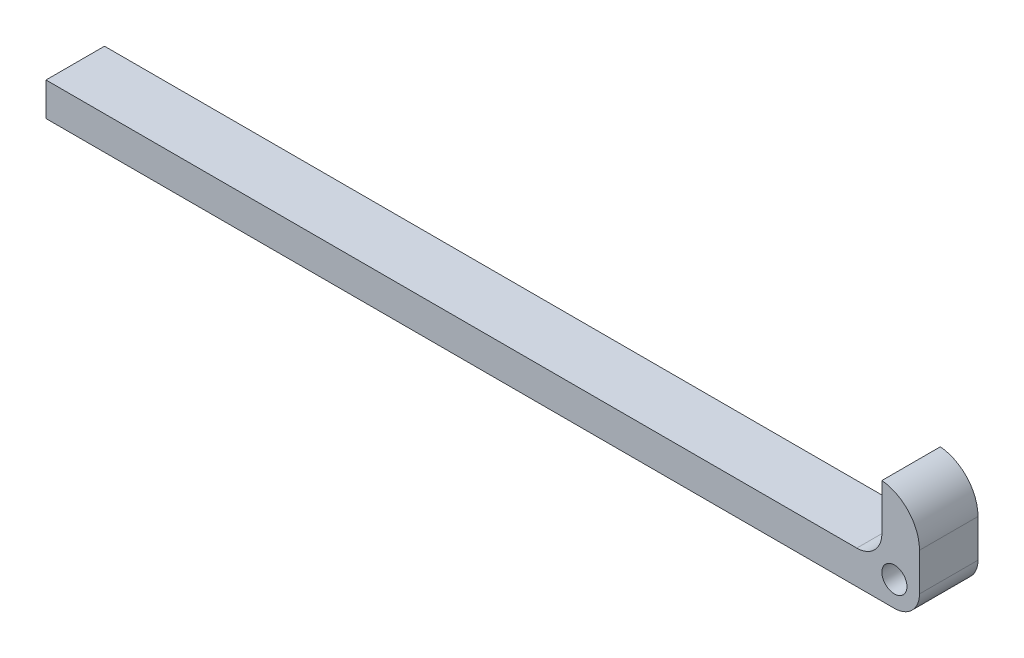
ISO-10303-21;
HEADER;
FILE_DESCRIPTION(('STEP AP214'),'2;1');
FILE_NAME('part.step','',(''),(''),'','','');
FILE_SCHEMA(('AUTOMOTIVE_DESIGN { 1 0 10303 214 1 1 1 1 }'));
ENDSEC;
DATA;
#1=APPLICATION_CONTEXT('core data for automotive mechanical design processes');
#2=APPLICATION_PROTOCOL_DEFINITION('international standard','automotive_design',2000,#1);
#3=PRODUCT_CONTEXT('',#1,'mechanical');
#4=PRODUCT('Part','Part','',(#3));
#5=PRODUCT_RELATED_PRODUCT_CATEGORY('part','',(#4));
#6=PRODUCT_DEFINITION_FORMATION('','',#4);
#7=PRODUCT_DEFINITION_CONTEXT('part definition',#1,'design');
#8=PRODUCT_DEFINITION('design','',#6,#7);
#9=PRODUCT_DEFINITION_SHAPE('','',#8);
#10=(LENGTH_UNIT() NAMED_UNIT(*) SI_UNIT(.MILLI.,.METRE.));
#11=(NAMED_UNIT(*) PLANE_ANGLE_UNIT() SI_UNIT($,.RADIAN.));
#12=(NAMED_UNIT(*) SI_UNIT($,.STERADIAN.) SOLID_ANGLE_UNIT());
#13=UNCERTAINTY_MEASURE_WITH_UNIT(LENGTH_MEASURE(1.E-05),#10,'distance_accuracy_value','');
#14=(GEOMETRIC_REPRESENTATION_CONTEXT(3) GLOBAL_UNCERTAINTY_ASSIGNED_CONTEXT((#13)) GLOBAL_UNIT_ASSIGNED_CONTEXT((#10,
#11,#12)) REPRESENTATION_CONTEXT('',''));
#15=CARTESIAN_POINT('',(0.,0.,0.));
#16=DIRECTION('',(0.,0.,1.));
#17=DIRECTION('',(1.,0.,0.));
#18=AXIS2_PLACEMENT_3D('',#15,#16,#17);
#19=CARTESIAN_POINT('',(-9.5,29.1972015517818,3.5));
#20=DIRECTION('',(1.,0.,0.));
#21=DIRECTION('',(0.,0.,-1.));
#22=AXIS2_PLACEMENT_3D('',#19,#20,#21);
#23=PLANE('',#22);
#24=DIRECTION('',(0.,1.,0.));
#25=VECTOR('',#24,1.);
#26=CARTESIAN_POINT('',(-9.5,29.1972015517818,-3.5));
#27=LINE('',#26,#25);
#28=CARTESIAN_POINT('',(-9.5,32.1972015517818,-3.5));
#29=VERTEX_POINT('',#28);
#30=CARTESIAN_POINT('',(-9.5,36.7222643662487,-3.5));
#31=VERTEX_POINT('',#30);
#32=EDGE_CURVE('E106',#29,#31,#27,.T.);
#33=ORIENTED_EDGE('',*,*,#32,.T.);
#34=DIRECTION('',(0.,0.,-1.));
#35=VECTOR('',#34,1.);
#36=CARTESIAN_POINT('',(-9.5,36.7222643662487,3.5));
#37=LINE('',#36,#35);
#38=CARTESIAN_POINT('',(-9.5,36.7222643662487,3.5));
#39=VERTEX_POINT('',#38);
#40=EDGE_CURVE('E157',#31,#39,#37,.F.);
#41=ORIENTED_EDGE('',*,*,#40,.T.);
#42=DIRECTION('',(0.,1.,0.));
#43=VECTOR('',#42,1.);
#44=CARTESIAN_POINT('',(-9.5,29.1972015517818,3.5));
#45=LINE('',#44,#43);
#46=CARTESIAN_POINT('',(-9.5,32.1972015517818,3.5));
#47=VERTEX_POINT('',#46);
#48=EDGE_CURVE('E139',#47,#39,#45,.T.);
#49=ORIENTED_EDGE('',*,*,#48,.F.);
#50=DIRECTION('',(0.,0.,-1.));
#51=VECTOR('',#50,1.);
#52=CARTESIAN_POINT('',(-9.5,32.1972015517818,-3.5));
#53=LINE('',#52,#51);
#54=EDGE_CURVE('E141',#47,#29,#53,.T.);
#55=ORIENTED_EDGE('',*,*,#54,.T.);
#56=EDGE_LOOP('',(#33,#41,#49,#55));
#57=FACE_BOUND('',#56,.T.);
#58=ADVANCED_FACE('F33',(#57),#23,.T.);
#59=CARTESIAN_POINT('',(-14.,29.1972015517818,3.5));
#60=DIRECTION('',(0.,0.,1.));
#61=DIRECTION('',(1.,0.,0.));
#62=AXIS2_PLACEMENT_3D('',#59,#60,#61);
#63=PLANE('',#62);
#64=CARTESIAN_POINT('',(-12.5,32.1972015517818,3.5));
#65=DIRECTION('',(0.,0.,1.));
#66=DIRECTION('',(1.,0.,0.));
#67=AXIS2_PLACEMENT_3D('',#64,#65,#66);
#68=CIRCLE('',#67,1.5);
#69=CARTESIAN_POINT('',(-11.,32.1972015517818,3.5));
#70=VERTEX_POINT('',#69);
#71=EDGE_CURVE('E126',#70,#70,#68,.T.);
#72=ORIENTED_EDGE('',*,*,#71,.F.);
#73=EDGE_LOOP('',(#72));
#74=FACE_BOUND('',#73,.T.);
#75=ORIENTED_EDGE('',*,*,#48,.T.);
#76=CARTESIAN_POINT('',(-14.5,36.7222643662487,3.5));
#77=DIRECTION('',(0.,0.,1.));
#78=DIRECTION('',(1.,0.,0.));
#79=AXIS2_PLACEMENT_3D('',#76,#77,#78);
#80=CIRCLE('',#79,5.);
#81=CARTESIAN_POINT('',(-14.,41.6972015517818,3.5));
#82=VERTEX_POINT('',#81);
#83=EDGE_CURVE('E159',#39,#82,#80,.T.);
#84=ORIENTED_EDGE('',*,*,#83,.T.);
#85=DIRECTION('',(0.,1.,0.));
#86=VECTOR('',#85,1.);
#87=CARTESIAN_POINT('',(-14.,29.1972015517818,3.5));
#88=LINE('',#87,#86);
#89=CARTESIAN_POINT('',(-14.,36.1972015517818,3.5));
#90=VERTEX_POINT('',#89);
#91=EDGE_CURVE('E142',#90,#82,#88,.T.);
#92=ORIENTED_EDGE('',*,*,#91,.F.);
#93=CARTESIAN_POINT('',(-17.,36.1972015517818,3.5));
#94=DIRECTION('',(0.,0.,1.));
#95=DIRECTION('',(1.,0.,0.));
#96=AXIS2_PLACEMENT_3D('',#93,#94,#95);
#97=CIRCLE('',#96,3.);
#98=CARTESIAN_POINT('',(-17.,33.1972015517818,3.5));
#99=VERTEX_POINT('',#98);
#100=EDGE_CURVE('E11',#90,#99,#97,.F.);
#101=ORIENTED_EDGE('',*,*,#100,.T.);
#102=DIRECTION('',(1.,0.,0.));
#103=VECTOR('',#102,1.);
#104=CARTESIAN_POINT('',(-114.,33.1972015517818,3.5));
#105=LINE('',#104,#103);
#106=CARTESIAN_POINT('',(-114.,33.1972015517818,3.5));
#107=VERTEX_POINT('',#106);
#108=EDGE_CURVE('E114',#107,#99,#105,.T.);
#109=ORIENTED_EDGE('',*,*,#108,.F.);
#110=DIRECTION('',(0.,1.,0.));
#111=VECTOR('',#110,1.);
#112=CARTESIAN_POINT('',(-114.,29.1972015517818,3.5));
#113=LINE('',#112,#111);
#114=CARTESIAN_POINT('',(-114.,29.1972015517818,3.5));
#115=VERTEX_POINT('',#114);
#116=EDGE_CURVE('E110',#115,#107,#113,.T.);
#117=ORIENTED_EDGE('',*,*,#116,.F.);
#118=DIRECTION('',(1.,0.,0.));
#119=VECTOR('',#118,1.);
#120=CARTESIAN_POINT('',(-14.,29.1972015517818,3.5));
#121=LINE('',#120,#119);
#122=CARTESIAN_POINT('',(-12.5,29.1972015517818,3.5));
#123=VERTEX_POINT('',#122);
#124=EDGE_CURVE('E96',#115,#123,#121,.T.);
#125=ORIENTED_EDGE('',*,*,#124,.T.);
#126=CARTESIAN_POINT('',(-12.5,32.1972015517818,3.5));
#127=DIRECTION('',(0.,0.,1.));
#128=DIRECTION('',(1.,0.,0.));
#129=AXIS2_PLACEMENT_3D('',#126,#127,#128);
#130=CIRCLE('',#129,3.);
#131=EDGE_CURVE('E153',#123,#47,#130,.T.);
#132=ORIENTED_EDGE('',*,*,#131,.T.);
#133=EDGE_LOOP('',(#75,#84,#92,#101,#109,#117,#125,#132));
#134=FACE_BOUND('',#133,.T.);
#135=ADVANCED_FACE('F112',(#74,#134),#63,.T.);
#136=CARTESIAN_POINT('',(-14.,29.1972015517818,-3.5));
#137=DIRECTION('',(-1.,0.,0.));
#138=DIRECTION('',(0.,0.,1.));
#139=AXIS2_PLACEMENT_3D('',#136,#137,#138);
#140=PLANE('',#139);
#141=DIRECTION('',(0.,1.,0.));
#142=VECTOR('',#141,1.);
#143=CARTESIAN_POINT('',(-14.,29.1972015517818,-3.5));
#144=LINE('',#143,#142);
#145=CARTESIAN_POINT('',(-14.,36.1972015517818,-3.5));
#146=VERTEX_POINT('',#145);
#147=CARTESIAN_POINT('',(-14.,41.6972015517818,-3.5));
#148=VERTEX_POINT('',#147);
#149=EDGE_CURVE('E144',#146,#148,#144,.T.);
#150=ORIENTED_EDGE('',*,*,#149,.F.);
#151=DIRECTION('',(0.,0.,-1.));
#152=VECTOR('',#151,1.);
#153=CARTESIAN_POINT('',(-14.,36.1972015517818,-3.5));
#154=LINE('',#153,#152);
#155=EDGE_CURVE('E54',#146,#90,#154,.F.);
#156=ORIENTED_EDGE('',*,*,#155,.T.);
#157=ORIENTED_EDGE('',*,*,#91,.T.);
#158=DIRECTION('',(0.,0.,1.));
#159=VECTOR('',#158,1.);
#160=CARTESIAN_POINT('',(-14.,41.6972015517818,-3.5));
#161=LINE('',#160,#159);
#162=EDGE_CURVE('E135',#148,#82,#161,.T.);
#163=ORIENTED_EDGE('',*,*,#162,.F.);
#164=EDGE_LOOP('',(#150,#156,#157,#163));
#165=FACE_BOUND('',#164,.T.);
#166=ADVANCED_FACE('F197',(#165),#140,.T.);
#167=CARTESIAN_POINT('',(-9.5,29.1972015517818,-3.5));
#168=DIRECTION('',(0.,0.,-1.));
#169=DIRECTION('',(-1.,0.,0.));
#170=AXIS2_PLACEMENT_3D('',#167,#168,#169);
#171=PLANE('',#170);
#172=CARTESIAN_POINT('',(-12.5,32.1972015517818,-3.5));
#173=DIRECTION('',(0.,0.,1.));
#174=DIRECTION('',(1.,0.,0.));
#175=AXIS2_PLACEMENT_3D('',#172,#173,#174);
#176=CIRCLE('',#175,1.5);
#177=CARTESIAN_POINT('',(-11.,32.1972015517818,-3.5));
#178=VERTEX_POINT('',#177);
#179=EDGE_CURVE('E123',#178,#178,#176,.T.);
#180=ORIENTED_EDGE('',*,*,#179,.T.);
#181=EDGE_LOOP('',(#180));
#182=FACE_BOUND('',#181,.T.);
#183=DIRECTION('',(1.,0.,0.));
#184=VECTOR('',#183,1.);
#185=CARTESIAN_POINT('',(-114.,33.1972015517818,-3.5));
#186=LINE('',#185,#184);
#187=CARTESIAN_POINT('',(-114.,33.1972015517818,-3.5));
#188=VERTEX_POINT('',#187);
#189=CARTESIAN_POINT('',(-17.,33.1972015517818,-3.5));
#190=VERTEX_POINT('',#189);
#191=EDGE_CURVE('E132',#188,#190,#186,.T.);
#192=ORIENTED_EDGE('',*,*,#191,.T.);
#193=CARTESIAN_POINT('',(-17.,36.1972015517818,-3.5));
#194=DIRECTION('',(0.,0.,-1.));
#195=DIRECTION('',(-1.,0.,0.));
#196=AXIS2_PLACEMENT_3D('',#193,#194,#195);
#197=CIRCLE('',#196,3.);
#198=EDGE_CURVE('E41',#190,#146,#197,.F.);
#199=ORIENTED_EDGE('',*,*,#198,.T.);
#200=ORIENTED_EDGE('',*,*,#149,.T.);
#201=CARTESIAN_POINT('',(-14.5,36.7222643662487,-3.5));
#202=DIRECTION('',(0.,0.,-1.));
#203=DIRECTION('',(-1.,0.,0.));
#204=AXIS2_PLACEMENT_3D('',#201,#202,#203);
#205=CIRCLE('',#204,5.);
#206=EDGE_CURVE('E155',#148,#31,#205,.T.);
#207=ORIENTED_EDGE('',*,*,#206,.T.);
#208=ORIENTED_EDGE('',*,*,#32,.F.);
#209=CARTESIAN_POINT('',(-12.5,32.1972015517818,-3.5));
#210=DIRECTION('',(0.,0.,-1.));
#211=DIRECTION('',(-1.,0.,0.));
#212=AXIS2_PLACEMENT_3D('',#209,#210,#211);
#213=CIRCLE('',#212,3.);
#214=CARTESIAN_POINT('',(-12.5,29.1972015517818,-3.5));
#215=VERTEX_POINT('',#214);
#216=EDGE_CURVE('E150',#29,#215,#213,.T.);
#217=ORIENTED_EDGE('',*,*,#216,.T.);
#218=DIRECTION('',(-1.,0.,0.));
#219=VECTOR('',#218,1.);
#220=CARTESIAN_POINT('',(-9.5,29.1972015517818,-3.5));
#221=LINE('',#220,#219);
#222=CARTESIAN_POINT('',(-114.,29.1972015517818,-3.5));
#223=VERTEX_POINT('',#222);
#224=EDGE_CURVE('E107',#215,#223,#221,.T.);
#225=ORIENTED_EDGE('',*,*,#224,.T.);
#226=DIRECTION('',(0.,-1.,0.));
#227=VECTOR('',#226,1.);
#228=CARTESIAN_POINT('',(-114.,29.1972015517818,-3.5));
#229=LINE('',#228,#227);
#230=EDGE_CURVE('E122',#188,#223,#229,.T.);
#231=ORIENTED_EDGE('',*,*,#230,.F.);
#232=EDGE_LOOP('',(#192,#199,#200,#207,#208,#217,#225,#231));
#233=FACE_BOUND('',#232,.T.);
#234=ADVANCED_FACE('F171',(#182,#233),#171,.T.);
#235=CARTESIAN_POINT('',(0.,29.1972015517818,0.));
#236=DIRECTION('',(0.,1.,0.));
#237=DIRECTION('',(0.,0.,1.));
#238=AXIS2_PLACEMENT_3D('',#235,#236,#237);
#239=PLANE('',#238);
#240=ORIENTED_EDGE('',*,*,#224,.F.);
#241=DIRECTION('',(0.,0.,-1.));
#242=VECTOR('',#241,1.);
#243=CARTESIAN_POINT('',(-12.5,29.1972015517818,3.5));
#244=LINE('',#243,#242);
#245=EDGE_CURVE('E103',#215,#123,#244,.F.);
#246=ORIENTED_EDGE('',*,*,#245,.T.);
#247=ORIENTED_EDGE('',*,*,#124,.F.);
#248=DIRECTION('',(0.,0.,1.));
#249=VECTOR('',#248,1.);
#250=CARTESIAN_POINT('',(-114.,29.1972015517818,-3.5));
#251=LINE('',#250,#249);
#252=EDGE_CURVE('E101',#223,#115,#251,.T.);
#253=ORIENTED_EDGE('',*,*,#252,.F.);
#254=EDGE_LOOP('',(#240,#246,#247,#253));
#255=FACE_BOUND('',#254,.T.);
#256=ADVANCED_FACE('F99',(#255),#239,.F.);
#257=CARTESIAN_POINT('',(-12.5,32.1972015517818,3.5));
#258=DIRECTION('',(0.,0.,1.));
#259=DIRECTION('',(1.,0.,0.));
#260=AXIS2_PLACEMENT_3D('',#257,#258,#259);
#261=CYLINDRICAL_SURFACE('',#260,3.);
#262=ORIENTED_EDGE('',*,*,#131,.F.);
#263=ORIENTED_EDGE('',*,*,#245,.F.);
#264=ORIENTED_EDGE('',*,*,#216,.F.);
#265=ORIENTED_EDGE('',*,*,#54,.F.);
#266=EDGE_LOOP('',(#262,#263,#264,#265));
#267=FACE_BOUND('',#266,.T.);
#268=ADVANCED_FACE('F174',(#267),#261,.T.);
#269=CARTESIAN_POINT('',(-114.,33.1972015517818,-3.5));
#270=DIRECTION('',(0.,-1.,0.));
#271=DIRECTION('',(0.,0.,-1.));
#272=AXIS2_PLACEMENT_3D('',#269,#270,#271);
#273=PLANE('',#272);
#274=ORIENTED_EDGE('',*,*,#108,.T.);
#275=DIRECTION('',(0.,0.,-1.));
#276=VECTOR('',#275,1.);
#277=CARTESIAN_POINT('',(-17.,33.1972015517818,-3.5));
#278=LINE('',#277,#276);
#279=EDGE_CURVE('E162',#99,#190,#278,.T.);
#280=ORIENTED_EDGE('',*,*,#279,.T.);
#281=ORIENTED_EDGE('',*,*,#191,.F.);
#282=DIRECTION('',(0.,0.,-1.));
#283=VECTOR('',#282,1.);
#284=CARTESIAN_POINT('',(-114.,33.1972015517818,-3.5));
#285=LINE('',#284,#283);
#286=EDGE_CURVE('E117',#107,#188,#285,.T.);
#287=ORIENTED_EDGE('',*,*,#286,.F.);
#288=EDGE_LOOP('',(#274,#280,#281,#287));
#289=FACE_BOUND('',#288,.T.);
#290=ADVANCED_FACE('F168',(#289),#273,.F.);
#291=CARTESIAN_POINT('',(-114.,0.,0.));
#292=DIRECTION('',(-1.,0.,0.));
#293=DIRECTION('',(0.,0.,1.));
#294=AXIS2_PLACEMENT_3D('',#291,#292,#293);
#295=PLANE('',#294);
#296=ORIENTED_EDGE('',*,*,#252,.T.);
#297=ORIENTED_EDGE('',*,*,#116,.T.);
#298=ORIENTED_EDGE('',*,*,#286,.T.);
#299=ORIENTED_EDGE('',*,*,#230,.T.);
#300=EDGE_LOOP('',(#296,#297,#298,#299));
#301=FACE_BOUND('',#300,.T.);
#302=ADVANCED_FACE('F120',(#301),#295,.T.);
#303=CARTESIAN_POINT('',(-14.5,36.7222643662487,0.));
#304=DIRECTION('',(0.,0.,1.));
#305=DIRECTION('',(1.,0.,0.));
#306=AXIS2_PLACEMENT_3D('',#303,#304,#305);
#307=CYLINDRICAL_SURFACE('',#306,5.);
#308=ORIENTED_EDGE('',*,*,#83,.F.);
#309=ORIENTED_EDGE('',*,*,#40,.F.);
#310=ORIENTED_EDGE('',*,*,#206,.F.);
#311=ORIENTED_EDGE('',*,*,#162,.T.);
#312=EDGE_LOOP('',(#308,#309,#310,#311));
#313=FACE_BOUND('',#312,.T.);
#314=ADVANCED_FACE('F182',(#313),#307,.T.);
#315=CARTESIAN_POINT('',(-17.,36.1972015517818,-3.5));
#316=DIRECTION('',(0.,0.,-1.));
#317=DIRECTION('',(-1.,0.,0.));
#318=AXIS2_PLACEMENT_3D('',#315,#316,#317);
#319=CYLINDRICAL_SURFACE('',#318,3.);
#320=ORIENTED_EDGE('',*,*,#100,.F.);
#321=ORIENTED_EDGE('',*,*,#155,.F.);
#322=ORIENTED_EDGE('',*,*,#198,.F.);
#323=ORIENTED_EDGE('',*,*,#279,.F.);
#324=EDGE_LOOP('',(#320,#321,#322,#323));
#325=FACE_BOUND('',#324,.T.);
#326=ADVANCED_FACE('F35',(#325),#319,.F.);
#327=CARTESIAN_POINT('',(-12.5,32.1972015517818,-3.5));
#328=DIRECTION('',(0.,0.,1.));
#329=DIRECTION('',(1.,0.,0.));
#330=AXIS2_PLACEMENT_3D('',#327,#328,#329);
#331=CYLINDRICAL_SURFACE('',#330,1.5);
#332=ORIENTED_EDGE('',*,*,#179,.F.);
#333=EDGE_LOOP('',(#332));
#334=FACE_BOUND('',#333,.T.);
#335=ORIENTED_EDGE('',*,*,#71,.T.);
#336=EDGE_LOOP('',(#335));
#337=FACE_BOUND('',#336,.T.);
#338=ADVANCED_FACE('F185',(#334,#337),#331,.F.);
#339=CLOSED_SHELL('',(#58,#135,#166,#234,#256,#268,#290,#302,#314,#326,#338));
#340=MANIFOLD_SOLID_BREP('B2',#339);
#341=ADVANCED_BREP_SHAPE_REPRESENTATION('',(#18,#340),#14);
#342=SHAPE_DEFINITION_REPRESENTATION(#9,#341);
ENDSEC;
END-ISO-10303-21;
